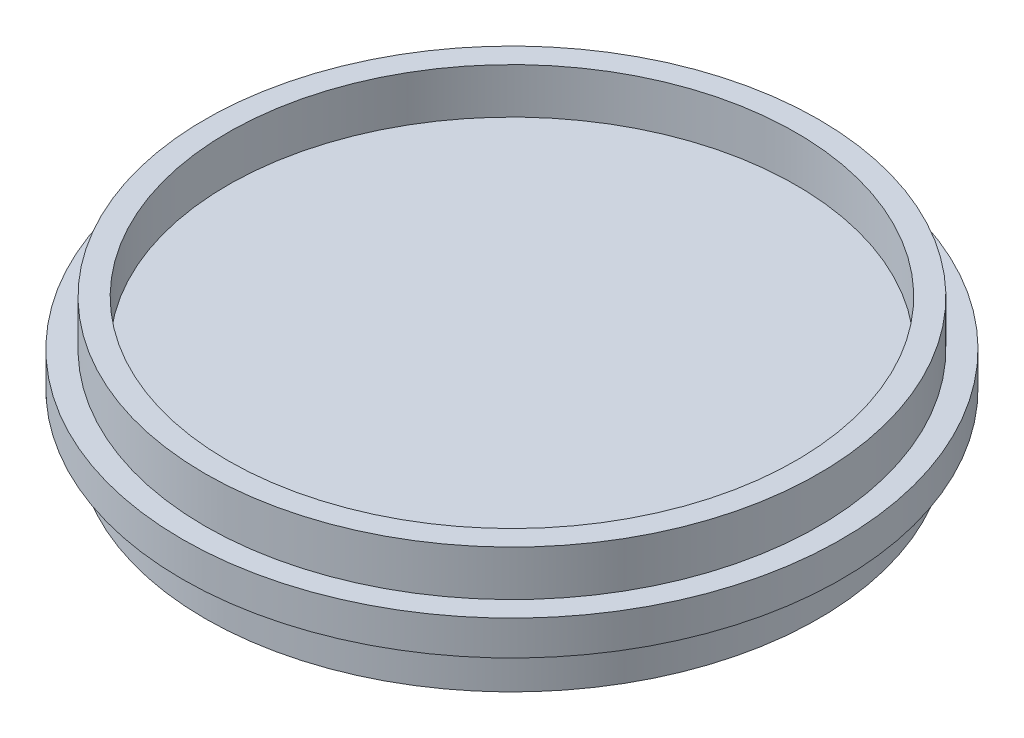
ISO-10303-21;
HEADER;
FILE_DESCRIPTION(('STEP AP214'),'2;1');
FILE_NAME('part.step','',(''),(''),'','','');
FILE_SCHEMA(('AUTOMOTIVE_DESIGN { 1 0 10303 214 1 1 1 1 }'));
ENDSEC;
DATA;
#1=APPLICATION_CONTEXT('core data for automotive mechanical design processes');
#2=APPLICATION_PROTOCOL_DEFINITION('international standard','automotive_design',2000,#1);
#3=PRODUCT_CONTEXT('',#1,'mechanical');
#4=PRODUCT('Part','Part','',(#3));
#5=PRODUCT_RELATED_PRODUCT_CATEGORY('part','',(#4));
#6=PRODUCT_DEFINITION_FORMATION('','',#4);
#7=PRODUCT_DEFINITION_CONTEXT('part definition',#1,'design');
#8=PRODUCT_DEFINITION('design','',#6,#7);
#9=PRODUCT_DEFINITION_SHAPE('','',#8);
#10=(LENGTH_UNIT() NAMED_UNIT(*) SI_UNIT(.MILLI.,.METRE.));
#11=(NAMED_UNIT(*) PLANE_ANGLE_UNIT() SI_UNIT($,.RADIAN.));
#12=(NAMED_UNIT(*) SI_UNIT($,.STERADIAN.) SOLID_ANGLE_UNIT());
#13=UNCERTAINTY_MEASURE_WITH_UNIT(LENGTH_MEASURE(1.E-05),#10,'distance_accuracy_value','');
#14=(GEOMETRIC_REPRESENTATION_CONTEXT(3) GLOBAL_UNCERTAINTY_ASSIGNED_CONTEXT((#13)) GLOBAL_UNIT_ASSIGNED_CONTEXT((#10,
#11,#12)) REPRESENTATION_CONTEXT('',''));
#15=CARTESIAN_POINT('',(0.,0.,0.));
#16=DIRECTION('',(0.,0.,1.));
#17=DIRECTION('',(1.,0.,0.));
#18=AXIS2_PLACEMENT_3D('',#15,#16,#17);
#19=CARTESIAN_POINT('',(0.,4.826,0.));
#20=DIRECTION('',(0.,-1.,0.));
#21=DIRECTION('',(0.,0.,-1.));
#22=AXIS2_PLACEMENT_3D('',#19,#20,#21);
#23=CYLINDRICAL_SURFACE('',#22,92.075);
#24=CARTESIAN_POINT('',(0.,4.826,0.));
#25=DIRECTION('',(0.,1.,0.));
#26=DIRECTION('',(0.,0.,1.));
#27=AXIS2_PLACEMENT_3D('',#24,#25,#26);
#28=CIRCLE('',#27,92.075);
#29=CARTESIAN_POINT('',(0.,4.826,92.075));
#30=VERTEX_POINT('',#29);
#31=EDGE_CURVE('E51',#30,#30,#28,.T.);
#32=ORIENTED_EDGE('',*,*,#31,.F.);
#33=EDGE_LOOP('',(#32));
#34=FACE_BOUND('',#33,.T.);
#35=CARTESIAN_POINT('',(0.,-4.826,0.));
#36=DIRECTION('',(0.,1.,0.));
#37=DIRECTION('',(0.,0.,1.));
#38=AXIS2_PLACEMENT_3D('',#35,#36,#37);
#39=CIRCLE('',#38,92.075);
#40=CARTESIAN_POINT('',(0.,-4.826,92.075));
#41=VERTEX_POINT('',#40);
#42=EDGE_CURVE('E56',#41,#41,#39,.T.);
#43=ORIENTED_EDGE('',*,*,#42,.T.);
#44=EDGE_LOOP('',(#43));
#45=FACE_BOUND('',#44,.T.);
#46=ADVANCED_FACE('F39',(#34,#45),#23,.T.);
#47=CARTESIAN_POINT('',(0.,4.826,0.));
#48=DIRECTION('',(0.,1.,0.));
#49=DIRECTION('',(0.,0.,1.));
#50=AXIS2_PLACEMENT_3D('',#47,#48,#49);
#51=PLANE('',#50);
#52=CARTESIAN_POINT('',(0.,4.826,0.));
#53=DIRECTION('',(0.,1.,0.));
#54=DIRECTION('',(0.,0.,1.));
#55=AXIS2_PLACEMENT_3D('',#52,#53,#54);
#56=CIRCLE('',#55,85.725);
#57=CARTESIAN_POINT('',(0.,4.826,85.725));
#58=VERTEX_POINT('',#57);
#59=EDGE_CURVE('E63',#58,#58,#56,.T.);
#60=ORIENTED_EDGE('',*,*,#59,.F.);
#61=EDGE_LOOP('',(#60));
#62=FACE_BOUND('',#61,.T.);
#63=ORIENTED_EDGE('',*,*,#31,.T.);
#64=EDGE_LOOP('',(#63));
#65=FACE_BOUND('',#64,.T.);
#66=ADVANCED_FACE('F103',(#62,#65),#51,.T.);
#67=CARTESIAN_POINT('',(0.,-4.826,0.));
#68=DIRECTION('',(0.,1.,0.));
#69=DIRECTION('',(0.,0.,1.));
#70=AXIS2_PLACEMENT_3D('',#67,#68,#69);
#71=PLANE('',#70);
#72=CARTESIAN_POINT('',(0.,-4.826,0.));
#73=DIRECTION('',(0.,1.,0.));
#74=DIRECTION('',(0.,0.,1.));
#75=AXIS2_PLACEMENT_3D('',#72,#73,#74);
#76=CIRCLE('',#75,85.725);
#77=CARTESIAN_POINT('',(0.,-4.826,85.725));
#78=VERTEX_POINT('',#77);
#79=EDGE_CURVE('E75',#78,#78,#76,.T.);
#80=ORIENTED_EDGE('',*,*,#79,.T.);
#81=EDGE_LOOP('',(#80));
#82=FACE_BOUND('',#81,.T.);
#83=ORIENTED_EDGE('',*,*,#42,.F.);
#84=EDGE_LOOP('',(#83));
#85=FACE_BOUND('',#84,.T.);
#86=ADVANCED_FACE('F99',(#82,#85),#71,.F.);
#87=CARTESIAN_POINT('',(0.,17.526,0.));
#88=DIRECTION('',(0.,1.,0.));
#89=DIRECTION('',(0.,0.,1.));
#90=AXIS2_PLACEMENT_3D('',#87,#88,#89);
#91=PLANE('',#90);
#92=CARTESIAN_POINT('',(0.,17.526,0.));
#93=DIRECTION('',(0.,1.,0.));
#94=DIRECTION('',(0.,0.,1.));
#95=AXIS2_PLACEMENT_3D('',#92,#93,#94);
#96=CIRCLE('',#95,85.725);
#97=CARTESIAN_POINT('',(0.,17.526,85.725));
#98=VERTEX_POINT('',#97);
#99=EDGE_CURVE('E61',#98,#98,#96,.T.);
#100=ORIENTED_EDGE('',*,*,#99,.T.);
#101=EDGE_LOOP('',(#100));
#102=FACE_BOUND('',#101,.T.);
#103=CARTESIAN_POINT('',(0.,17.526,0.));
#104=DIRECTION('',(0.,1.,0.));
#105=DIRECTION('',(0.,0.,1.));
#106=AXIS2_PLACEMENT_3D('',#103,#104,#105);
#107=CIRCLE('',#106,79.375);
#108=CARTESIAN_POINT('',(0.,17.526,79.375));
#109=VERTEX_POINT('',#108);
#110=EDGE_CURVE('E67',#109,#109,#107,.T.);
#111=ORIENTED_EDGE('',*,*,#110,.F.);
#112=EDGE_LOOP('',(#111));
#113=FACE_BOUND('',#112,.T.);
#114=ADVANCED_FACE('F116',(#102,#113),#91,.T.);
#115=CARTESIAN_POINT('',(0.,17.526,0.));
#116=DIRECTION('',(0.,-1.,0.));
#117=DIRECTION('',(0.,0.,-1.));
#118=AXIS2_PLACEMENT_3D('',#115,#116,#117);
#119=CYLINDRICAL_SURFACE('',#118,85.725);
#120=ORIENTED_EDGE('',*,*,#99,.F.);
#121=EDGE_LOOP('',(#120));
#122=FACE_BOUND('',#121,.T.);
#123=ORIENTED_EDGE('',*,*,#59,.T.);
#124=EDGE_LOOP('',(#123));
#125=FACE_BOUND('',#124,.T.);
#126=ADVANCED_FACE('F121',(#122,#125),#119,.T.);
#127=CARTESIAN_POINT('',(0.,17.526,0.));
#128=DIRECTION('',(0.,-1.,0.));
#129=DIRECTION('',(0.,0.,-1.));
#130=AXIS2_PLACEMENT_3D('',#127,#128,#129);
#131=CYLINDRICAL_SURFACE('',#130,79.375);
#132=ORIENTED_EDGE('',*,*,#110,.T.);
#133=EDGE_LOOP('',(#132));
#134=FACE_BOUND('',#133,.T.);
#135=CARTESIAN_POINT('',(0.,4.826,0.));
#136=DIRECTION('',(0.,1.,0.));
#137=DIRECTION('',(0.,0.,1.));
#138=AXIS2_PLACEMENT_3D('',#135,#136,#137);
#139=CIRCLE('',#138,79.375);
#140=CARTESIAN_POINT('',(0.,4.826,79.375));
#141=VERTEX_POINT('',#140);
#142=EDGE_CURVE('E46',#141,#141,#139,.F.);
#143=ORIENTED_EDGE('',*,*,#142,.T.);
#144=EDGE_LOOP('',(#143));
#145=FACE_BOUND('',#144,.T.);
#146=ADVANCED_FACE('F126',(#134,#145),#131,.F.);
#147=ORIENTED_EDGE('',*,*,#142,.F.);
#148=EDGE_LOOP('',(#147));
#149=FACE_BOUND('',#148,.T.);
#150=ADVANCED_FACE('F110',(#149),#51,.T.);
#151=CARTESIAN_POINT('',(0.,-17.526,0.));
#152=DIRECTION('',(0.,1.,0.));
#153=DIRECTION('',(0.,0.,1.));
#154=AXIS2_PLACEMENT_3D('',#151,#152,#153);
#155=CYLINDRICAL_SURFACE('',#154,85.725);
#156=CARTESIAN_POINT('',(0.,-17.526,0.));
#157=DIRECTION('',(0.,1.,0.));
#158=DIRECTION('',(0.,0.,1.));
#159=AXIS2_PLACEMENT_3D('',#156,#157,#158);
#160=CIRCLE('',#159,85.725);
#161=CARTESIAN_POINT('',(0.,-17.526,85.725));
#162=VERTEX_POINT('',#161);
#163=EDGE_CURVE('E74',#162,#162,#160,.T.);
#164=ORIENTED_EDGE('',*,*,#163,.T.);
#165=EDGE_LOOP('',(#164));
#166=FACE_BOUND('',#165,.T.);
#167=ORIENTED_EDGE('',*,*,#79,.F.);
#168=EDGE_LOOP('',(#167));
#169=FACE_BOUND('',#168,.T.);
#170=ADVANCED_FACE('F100',(#166,#169),#155,.T.);
#171=CARTESIAN_POINT('',(0.,-17.526,0.));
#172=DIRECTION('',(0.,-1.,0.));
#173=DIRECTION('',(0.,0.,1.));
#174=AXIS2_PLACEMENT_3D('',#171,#172,#173);
#175=PLANE('',#174);
#176=CARTESIAN_POINT('',(0.,-17.526,0.));
#177=DIRECTION('',(0.,1.,0.));
#178=DIRECTION('',(0.,0.,1.));
#179=AXIS2_PLACEMENT_3D('',#176,#177,#178);
#180=CIRCLE('',#179,79.375);
#181=CARTESIAN_POINT('',(0.,-17.526,79.375));
#182=VERTEX_POINT('',#181);
#183=EDGE_CURVE('E79',#182,#182,#180,.T.);
#184=ORIENTED_EDGE('',*,*,#183,.T.);
#185=EDGE_LOOP('',(#184));
#186=FACE_BOUND('',#185,.T.);
#187=ORIENTED_EDGE('',*,*,#163,.F.);
#188=EDGE_LOOP('',(#187));
#189=FACE_BOUND('',#188,.T.);
#190=ADVANCED_FACE('F87',(#186,#189),#175,.T.);
#191=CARTESIAN_POINT('',(0.,-17.526,0.));
#192=DIRECTION('',(0.,1.,0.));
#193=DIRECTION('',(0.,0.,1.));
#194=AXIS2_PLACEMENT_3D('',#191,#192,#193);
#195=CYLINDRICAL_SURFACE('',#194,79.375);
#196=ORIENTED_EDGE('',*,*,#183,.F.);
#197=EDGE_LOOP('',(#196));
#198=FACE_BOUND('',#197,.T.);
#199=CARTESIAN_POINT('',(0.,-4.826,0.));
#200=DIRECTION('',(0.,1.,0.));
#201=DIRECTION('',(0.,0.,1.));
#202=AXIS2_PLACEMENT_3D('',#199,#200,#201);
#203=CIRCLE('',#202,79.375);
#204=CARTESIAN_POINT('',(0.,-4.826,79.375));
#205=VERTEX_POINT('',#204);
#206=EDGE_CURVE('E10',#205,#205,#203,.T.);
#207=ORIENTED_EDGE('',*,*,#206,.T.);
#208=EDGE_LOOP('',(#207));
#209=FACE_BOUND('',#208,.T.);
#210=ADVANCED_FACE('F90',(#198,#209),#195,.F.);
#211=ORIENTED_EDGE('',*,*,#206,.F.);
#212=EDGE_LOOP('',(#211));
#213=FACE_BOUND('',#212,.T.);
#214=ADVANCED_FACE('F92',(#213),#71,.F.);
#215=CLOSED_SHELL('',(#46,#66,#86,#114,#126,#146,#150,#170,#190,#210,#214));
#216=MANIFOLD_SOLID_BREP('B2',#215);
#217=ADVANCED_BREP_SHAPE_REPRESENTATION('',(#18,#216),#14);
#218=SHAPE_DEFINITION_REPRESENTATION(#9,#217);
ENDSEC;
END-ISO-10303-21;
